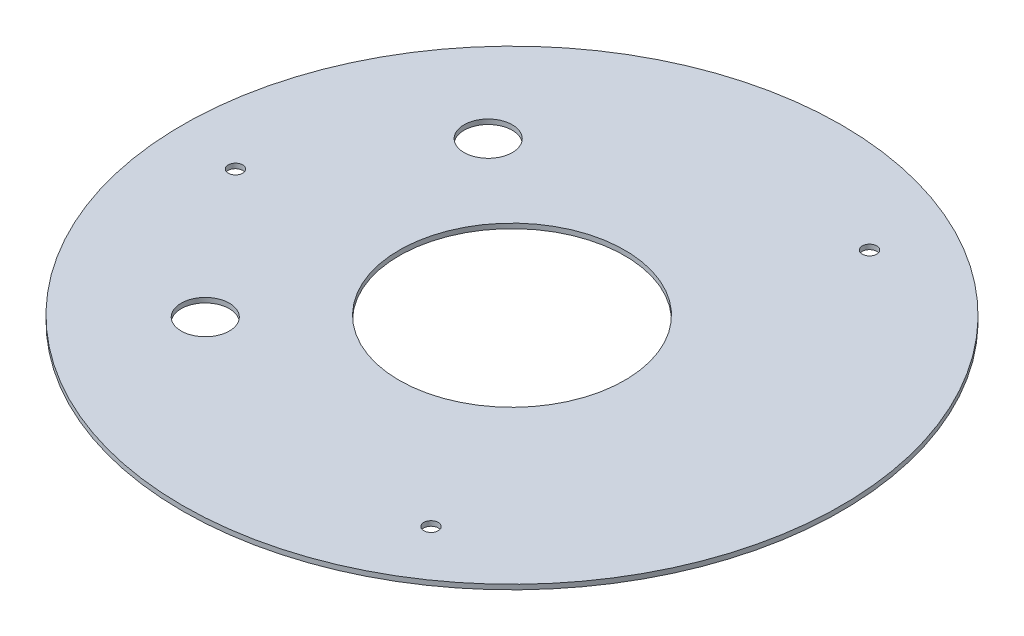
ISO-10303-21;
HEADER;
FILE_DESCRIPTION(('STEP AP214'),'2;1');
FILE_NAME('part.step','',(''),(''),'','','');
FILE_SCHEMA(('AUTOMOTIVE_DESIGN { 1 0 10303 214 1 1 1 1 }'));
ENDSEC;
DATA;
#1=APPLICATION_CONTEXT('core data for automotive mechanical design processes');
#2=APPLICATION_PROTOCOL_DEFINITION('international standard','automotive_design',2000,#1);
#3=PRODUCT_CONTEXT('',#1,'mechanical');
#4=PRODUCT('Part','Part','',(#3));
#5=PRODUCT_RELATED_PRODUCT_CATEGORY('part','',(#4));
#6=PRODUCT_DEFINITION_FORMATION('','',#4);
#7=PRODUCT_DEFINITION_CONTEXT('part definition',#1,'design');
#8=PRODUCT_DEFINITION('design','',#6,#7);
#9=PRODUCT_DEFINITION_SHAPE('','',#8);
#10=(LENGTH_UNIT() NAMED_UNIT(*) SI_UNIT(.MILLI.,.METRE.));
#11=(NAMED_UNIT(*) PLANE_ANGLE_UNIT() SI_UNIT($,.RADIAN.));
#12=(NAMED_UNIT(*) SI_UNIT($,.STERADIAN.) SOLID_ANGLE_UNIT());
#13=UNCERTAINTY_MEASURE_WITH_UNIT(LENGTH_MEASURE(1.E-05),#10,'distance_accuracy_value','');
#14=(GEOMETRIC_REPRESENTATION_CONTEXT(3) GLOBAL_UNCERTAINTY_ASSIGNED_CONTEXT((#13)) GLOBAL_UNIT_ASSIGNED_CONTEXT((#10,
#11,#12)) REPRESENTATION_CONTEXT('',''));
#15=CARTESIAN_POINT('',(0.,0.,0.));
#16=DIRECTION('',(0.,0.,1.));
#17=DIRECTION('',(1.,0.,0.));
#18=AXIS2_PLACEMENT_3D('',#15,#16,#17);
#19=CARTESIAN_POINT('',(73.2496011945377,1.,33.2166503223373));
#20=DIRECTION('',(0.,1.,0.));
#21=DIRECTION('',(0.,0.,1.));
#22=AXIS2_PLACEMENT_3D('',#19,#20,#21);
#23=PLANE('',#22);
#24=CARTESIAN_POINT('',(41.7658419540778,1.,65.3689893366106));
#25=DIRECTION('',(0.,1.,0.));
#26=DIRECTION('',(0.,0.,1.));
#27=AXIS2_PLACEMENT_3D('',#24,#25,#26);
#28=CIRCLE('',#27,5.);
#29=CARTESIAN_POINT('',(41.7658419540778,1.,70.3689893366106));
#30=VERTEX_POINT('',#29);
#31=EDGE_CURVE('E70',#30,#30,#28,.T.);
#32=ORIENTED_EDGE('',*,*,#31,.F.);
#33=EDGE_LOOP('',(#32));
#34=FACE_BOUND('',#33,.T.);
#35=CARTESIAN_POINT('',(39.0563912212829,1.,3.96217388325347));
#36=DIRECTION('',(0.,1.,0.));
#37=DIRECTION('',(0.,0.,1.));
#38=AXIS2_PLACEMENT_3D('',#35,#36,#37);
#39=CIRCLE('',#38,5.);
#40=CARTESIAN_POINT('',(39.0563912212829,1.,8.96217388325347));
#41=VERTEX_POINT('',#40);
#42=EDGE_CURVE('E69',#41,#41,#39,.T.);
#43=ORIENTED_EDGE('',*,*,#42,.F.);
#44=EDGE_LOOP('',(#43));
#45=FACE_BOUND('',#44,.T.);
#46=CARTESIAN_POINT('',(102.822466875922,1.,79.5895477451951));
#47=DIRECTION('',(0.,-1.,0.));
#48=DIRECTION('',(0.,0.,-1.));
#49=AXIS2_PLACEMENT_3D('',#46,#47,#48);
#50=CIRCLE('',#49,1.50000000000001);
#51=CARTESIAN_POINT('',(102.822466875922,1.,78.0895477451951));
#52=VERTEX_POINT('',#51);
#53=EDGE_CURVE('E63',#52,#52,#50,.T.);
#54=ORIENTED_EDGE('',*,*,#53,.T.);
#55=EDGE_LOOP('',(#54));
#56=FACE_BOUND('',#55,.T.);
#57=CARTESIAN_POINT('',(73.2496011945377,1.,33.2166503223373));
#58=DIRECTION('',(0.,1.,0.));
#59=DIRECTION('',(0.,0.,1.));
#60=AXIS2_PLACEMENT_3D('',#57,#58,#59);
#61=CIRCLE('',#60,23.4009999999999);
#62=CARTESIAN_POINT('',(73.2496011945377,1.,56.6176503223373));
#63=VERTEX_POINT('',#62);
#64=EDGE_CURVE('E50',#63,#63,#61,.T.);
#65=ORIENTED_EDGE('',*,*,#64,.F.);
#66=EDGE_LOOP('',(#65));
#67=FACE_BOUND('',#66,.T.);
#68=CARTESIAN_POINT('',(73.2496011945377,1.,33.2166503223373));
#69=DIRECTION('',(0.,1.,0.));
#70=DIRECTION('',(0.,0.,1.));
#71=AXIS2_PLACEMENT_3D('',#68,#69,#70);
#72=CIRCLE('',#71,68.3699999983781);
#73=CARTESIAN_POINT('',(73.2496011945377,1.,101.586650320715));
#74=VERTEX_POINT('',#73);
#75=EDGE_CURVE('E10',#74,#74,#72,.T.);
#76=ORIENTED_EDGE('',*,*,#75,.T.);
#77=EDGE_LOOP('',(#76));
#78=FACE_BOUND('',#77,.T.);
#79=CARTESIAN_POINT('',(18.3030611385606,1.,35.6410545536932));
#80=DIRECTION('',(0.,-1.,0.));
#81=DIRECTION('',(0.,0.,-1.));
#82=AXIS2_PLACEMENT_3D('',#79,#80,#81);
#83=CIRCLE('',#82,1.50000000000001);
#84=CARTESIAN_POINT('',(18.3030611385606,1.,34.1410545536932));
#85=VERTEX_POINT('',#84);
#86=EDGE_CURVE('E59',#85,#85,#83,.T.);
#87=ORIENTED_EDGE('',*,*,#86,.T.);
#88=EDGE_LOOP('',(#87));
#89=FACE_BOUND('',#88,.T.);
#90=CARTESIAN_POINT('',(98.6232755691298,1.,-15.5806513318759));
#91=DIRECTION('',(0.,-1.,0.));
#92=DIRECTION('',(0.,0.,-1.));
#93=AXIS2_PLACEMENT_3D('',#90,#91,#92);
#94=CIRCLE('',#93,1.5);
#95=CARTESIAN_POINT('',(98.6232755691298,1.,-17.0806513318759));
#96=VERTEX_POINT('',#95);
#97=EDGE_CURVE('E66',#96,#96,#94,.T.);
#98=ORIENTED_EDGE('',*,*,#97,.T.);
#99=EDGE_LOOP('',(#98));
#100=FACE_BOUND('',#99,.T.);
#101=ADVANCED_FACE('F34',(#34,#45,#56,#67,#78,#89,#100),#23,.T.);
#102=CARTESIAN_POINT('',(73.2496011945377,0.,33.2166503223373));
#103=DIRECTION('',(0.,1.,0.));
#104=DIRECTION('',(0.,0.,1.));
#105=AXIS2_PLACEMENT_3D('',#102,#103,#104);
#106=PLANE('',#105);
#107=CARTESIAN_POINT('',(41.7658419540778,0.,65.3689893366106));
#108=DIRECTION('',(0.,1.,0.));
#109=DIRECTION('',(0.,0.,1.));
#110=AXIS2_PLACEMENT_3D('',#107,#108,#109);
#111=CIRCLE('',#110,5.);
#112=CARTESIAN_POINT('',(41.7658419540778,0.,70.3689893366106));
#113=VERTEX_POINT('',#112);
#114=EDGE_CURVE('E38',#113,#113,#111,.T.);
#115=ORIENTED_EDGE('',*,*,#114,.T.);
#116=EDGE_LOOP('',(#115));
#117=FACE_BOUND('',#116,.T.);
#118=CARTESIAN_POINT('',(39.0563912212829,0.,3.96217388325347));
#119=DIRECTION('',(0.,1.,0.));
#120=DIRECTION('',(0.,0.,1.));
#121=AXIS2_PLACEMENT_3D('',#118,#119,#120);
#122=CIRCLE('',#121,5.);
#123=CARTESIAN_POINT('',(39.0563912212829,0.,8.96217388325347));
#124=VERTEX_POINT('',#123);
#125=EDGE_CURVE('E67',#124,#124,#122,.T.);
#126=ORIENTED_EDGE('',*,*,#125,.T.);
#127=EDGE_LOOP('',(#126));
#128=FACE_BOUND('',#127,.T.);
#129=CARTESIAN_POINT('',(73.2496011945377,0.,33.2166503223373));
#130=DIRECTION('',(0.,1.,0.));
#131=DIRECTION('',(0.,0.,1.));
#132=AXIS2_PLACEMENT_3D('',#129,#130,#131);
#133=CIRCLE('',#132,68.3699999983781);
#134=CARTESIAN_POINT('',(73.2496011945377,0.,101.586650320715));
#135=VERTEX_POINT('',#134);
#136=EDGE_CURVE('E43',#135,#135,#133,.T.);
#137=ORIENTED_EDGE('',*,*,#136,.F.);
#138=EDGE_LOOP('',(#137));
#139=FACE_BOUND('',#138,.T.);
#140=CARTESIAN_POINT('',(73.2496011945377,0.,33.2166503223373));
#141=DIRECTION('',(0.,1.,0.));
#142=DIRECTION('',(0.,0.,1.));
#143=AXIS2_PLACEMENT_3D('',#140,#141,#142);
#144=CIRCLE('',#143,23.4009999999999);
#145=CARTESIAN_POINT('',(73.2496011945377,0.,56.6176503223373));
#146=VERTEX_POINT('',#145);
#147=EDGE_CURVE('E53',#146,#146,#144,.T.);
#148=ORIENTED_EDGE('',*,*,#147,.T.);
#149=EDGE_LOOP('',(#148));
#150=FACE_BOUND('',#149,.T.);
#151=CARTESIAN_POINT('',(18.3030611385606,0.,35.6410545536932));
#152=DIRECTION('',(0.,1.,0.));
#153=DIRECTION('',(0.,0.,1.));
#154=AXIS2_PLACEMENT_3D('',#151,#152,#153);
#155=CIRCLE('',#154,1.50000000000001);
#156=CARTESIAN_POINT('',(18.3030611385606,0.,37.1410545536932));
#157=VERTEX_POINT('',#156);
#158=EDGE_CURVE('E56',#157,#157,#155,.F.);
#159=ORIENTED_EDGE('',*,*,#158,.F.);
#160=EDGE_LOOP('',(#159));
#161=FACE_BOUND('',#160,.T.);
#162=CARTESIAN_POINT('',(102.822466875922,0.,79.5895477451951));
#163=DIRECTION('',(0.,1.,0.));
#164=DIRECTION('',(0.,0.,1.));
#165=AXIS2_PLACEMENT_3D('',#162,#163,#164);
#166=CIRCLE('',#165,1.50000000000001);
#167=CARTESIAN_POINT('',(102.822466875922,0.,81.0895477451951));
#168=VERTEX_POINT('',#167);
#169=EDGE_CURVE('E60',#168,#168,#166,.F.);
#170=ORIENTED_EDGE('',*,*,#169,.F.);
#171=EDGE_LOOP('',(#170));
#172=FACE_BOUND('',#171,.T.);
#173=CARTESIAN_POINT('',(98.6232755691298,0.,-15.5806513318759));
#174=DIRECTION('',(0.,1.,0.));
#175=DIRECTION('',(0.,0.,1.));
#176=AXIS2_PLACEMENT_3D('',#173,#174,#175);
#177=CIRCLE('',#176,1.5);
#178=CARTESIAN_POINT('',(98.6232755691298,0.,-14.0806513318759));
#179=VERTEX_POINT('',#178);
#180=EDGE_CURVE('E64',#179,#179,#177,.F.);
#181=ORIENTED_EDGE('',*,*,#180,.F.);
#182=EDGE_LOOP('',(#181));
#183=FACE_BOUND('',#182,.T.);
#184=ADVANCED_FACE('F92',(#117,#128,#139,#150,#161,#172,#183),#106,.F.);
#185=CARTESIAN_POINT('',(73.2496011945377,1.,33.2166503223373));
#186=DIRECTION('',(0.,-1.,0.));
#187=DIRECTION('',(0.,0.,-1.));
#188=AXIS2_PLACEMENT_3D('',#185,#186,#187);
#189=CYLINDRICAL_SURFACE('',#188,68.3699999983781);
#190=ORIENTED_EDGE('',*,*,#75,.F.);
#191=EDGE_LOOP('',(#190));
#192=FACE_BOUND('',#191,.T.);
#193=ORIENTED_EDGE('',*,*,#136,.T.);
#194=EDGE_LOOP('',(#193));
#195=FACE_BOUND('',#194,.T.);
#196=ADVANCED_FACE('F36',(#192,#195),#189,.T.);
#197=CARTESIAN_POINT('',(73.2496011945377,1.,33.2166503223373));
#198=DIRECTION('',(0.,-1.,0.));
#199=DIRECTION('',(0.,0.,-1.));
#200=AXIS2_PLACEMENT_3D('',#197,#198,#199);
#201=CYLINDRICAL_SURFACE('',#200,23.4009999999999);
#202=ORIENTED_EDGE('',*,*,#64,.T.);
#203=EDGE_LOOP('',(#202));
#204=FACE_BOUND('',#203,.T.);
#205=ORIENTED_EDGE('',*,*,#147,.F.);
#206=EDGE_LOOP('',(#205));
#207=FACE_BOUND('',#206,.T.);
#208=ADVANCED_FACE('F95',(#204,#207),#201,.F.);
#209=CARTESIAN_POINT('',(18.3030611385606,-9.,35.6410545536932));
#210=DIRECTION('',(0.,1.,0.));
#211=DIRECTION('',(0.,0.,1.));
#212=AXIS2_PLACEMENT_3D('',#209,#210,#211);
#213=CYLINDRICAL_SURFACE('',#212,1.50000000000001);
#214=ORIENTED_EDGE('',*,*,#86,.F.);
#215=EDGE_LOOP('',(#214));
#216=FACE_BOUND('',#215,.T.);
#217=ORIENTED_EDGE('',*,*,#158,.T.);
#218=EDGE_LOOP('',(#217));
#219=FACE_BOUND('',#218,.T.);
#220=ADVANCED_FACE('F97',(#216,#219),#213,.F.);
#221=CARTESIAN_POINT('',(102.822466875922,-9.,79.5895477451951));
#222=DIRECTION('',(0.,1.,0.));
#223=DIRECTION('',(0.,0.,1.));
#224=AXIS2_PLACEMENT_3D('',#221,#222,#223);
#225=CYLINDRICAL_SURFACE('',#224,1.50000000000001);
#226=ORIENTED_EDGE('',*,*,#53,.F.);
#227=EDGE_LOOP('',(#226));
#228=FACE_BOUND('',#227,.T.);
#229=ORIENTED_EDGE('',*,*,#169,.T.);
#230=EDGE_LOOP('',(#229));
#231=FACE_BOUND('',#230,.T.);
#232=ADVANCED_FACE('F103',(#228,#231),#225,.F.);
#233=CARTESIAN_POINT('',(98.6232755691298,-9.,-15.5806513318759));
#234=DIRECTION('',(0.,1.,0.));
#235=DIRECTION('',(0.,0.,1.));
#236=AXIS2_PLACEMENT_3D('',#233,#234,#235);
#237=CYLINDRICAL_SURFACE('',#236,1.5);
#238=ORIENTED_EDGE('',*,*,#97,.F.);
#239=EDGE_LOOP('',(#238));
#240=FACE_BOUND('',#239,.T.);
#241=ORIENTED_EDGE('',*,*,#180,.T.);
#242=EDGE_LOOP('',(#241));
#243=FACE_BOUND('',#242,.T.);
#244=ADVANCED_FACE('F123',(#240,#243),#237,.F.);
#245=CARTESIAN_POINT('',(39.0563912212829,6.,3.96217388325347));
#246=DIRECTION('',(0.,-1.,0.));
#247=DIRECTION('',(0.,0.,-1.));
#248=AXIS2_PLACEMENT_3D('',#245,#246,#247);
#249=CYLINDRICAL_SURFACE('',#248,5.);
#250=ORIENTED_EDGE('',*,*,#42,.T.);
#251=EDGE_LOOP('',(#250));
#252=FACE_BOUND('',#251,.T.);
#253=ORIENTED_EDGE('',*,*,#125,.F.);
#254=EDGE_LOOP('',(#253));
#255=FACE_BOUND('',#254,.T.);
#256=ADVANCED_FACE('F126',(#252,#255),#249,.F.);
#257=CARTESIAN_POINT('',(41.7658419540778,6.,65.3689893366106));
#258=DIRECTION('',(0.,-1.,0.));
#259=DIRECTION('',(0.,0.,-1.));
#260=AXIS2_PLACEMENT_3D('',#257,#258,#259);
#261=CYLINDRICAL_SURFACE('',#260,5.);
#262=ORIENTED_EDGE('',*,*,#31,.T.);
#263=EDGE_LOOP('',(#262));
#264=FACE_BOUND('',#263,.T.);
#265=ORIENTED_EDGE('',*,*,#114,.F.);
#266=EDGE_LOOP('',(#265));
#267=FACE_BOUND('',#266,.T.);
#268=ADVANCED_FACE('F134',(#264,#267),#261,.F.);
#269=CLOSED_SHELL('',(#101,#184,#196,#208,#220,#232,#244,#256,#268));
#270=MANIFOLD_SOLID_BREP('B2',#269);
#271=ADVANCED_BREP_SHAPE_REPRESENTATION('',(#18,#270),#14);
#272=SHAPE_DEFINITION_REPRESENTATION(#9,#271);
ENDSEC;
END-ISO-10303-21;
